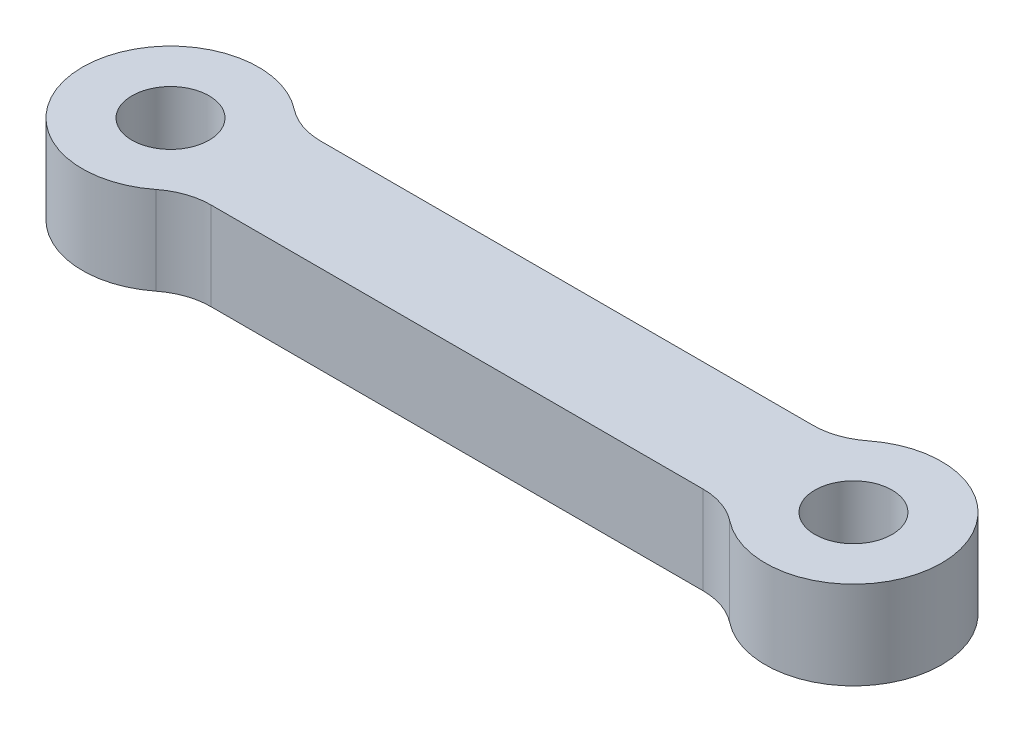
ISO-10303-21;
HEADER;
FILE_DESCRIPTION(('STEP AP214'),'2;1');
FILE_NAME('part.step','',(''),(''),'','','');
FILE_SCHEMA(('AUTOMOTIVE_DESIGN { 1 0 10303 214 1 1 1 1 }'));
ENDSEC;
DATA;
#1=APPLICATION_CONTEXT('core data for automotive mechanical design processes');
#2=APPLICATION_PROTOCOL_DEFINITION('international standard','automotive_design',2000,#1);
#3=PRODUCT_CONTEXT('',#1,'mechanical');
#4=PRODUCT('Part','Part','',(#3));
#5=PRODUCT_RELATED_PRODUCT_CATEGORY('part','',(#4));
#6=PRODUCT_DEFINITION_FORMATION('','',#4);
#7=PRODUCT_DEFINITION_CONTEXT('part definition',#1,'design');
#8=PRODUCT_DEFINITION('design','',#6,#7);
#9=PRODUCT_DEFINITION_SHAPE('','',#8);
#10=(LENGTH_UNIT() NAMED_UNIT(*) SI_UNIT(.MILLI.,.METRE.));
#11=(NAMED_UNIT(*) PLANE_ANGLE_UNIT() SI_UNIT($,.RADIAN.));
#12=(NAMED_UNIT(*) SI_UNIT($,.STERADIAN.) SOLID_ANGLE_UNIT());
#13=UNCERTAINTY_MEASURE_WITH_UNIT(LENGTH_MEASURE(1.E-05),#10,'distance_accuracy_value','');
#14=(GEOMETRIC_REPRESENTATION_CONTEXT(3) GLOBAL_UNCERTAINTY_ASSIGNED_CONTEXT((#13)) GLOBAL_UNIT_ASSIGNED_CONTEXT((#10,
#11,#12)) REPRESENTATION_CONTEXT('',''));
#15=CARTESIAN_POINT('',(0.,0.,0.));
#16=DIRECTION('',(0.,0.,1.));
#17=DIRECTION('',(1.,0.,0.));
#18=AXIS2_PLACEMENT_3D('',#15,#16,#17);
#19=CARTESIAN_POINT('',(-31.,4.,0.));
#20=DIRECTION('',(0.,1.,0.));
#21=DIRECTION('',(0.,0.,1.));
#22=AXIS2_PLACEMENT_3D('',#19,#20,#21);
#23=PLANE('',#22);
#24=CARTESIAN_POINT('',(-31.,4.,0.));
#25=DIRECTION('',(0.,1.,0.));
#26=DIRECTION('',(0.,0.,1.));
#27=AXIS2_PLACEMENT_3D('',#24,#25,#26);
#28=CIRCLE('',#27,1.75);
#29=CARTESIAN_POINT('',(-31.,4.,1.75));
#30=VERTEX_POINT('',#29);
#31=EDGE_CURVE('E178',#30,#30,#28,.T.);
#32=ORIENTED_EDGE('',*,*,#31,.F.);
#33=EDGE_LOOP('',(#32));
#34=FACE_BOUND('',#33,.T.);
#35=DIRECTION('',(-1.,0.,0.));
#36=VECTOR('',#35,1.);
#37=CARTESIAN_POINT('',(-27.8775010008008,4.,-2.5));
#38=LINE('',#37,#36);
#39=CARTESIAN_POINT('',(-4.33012701892219,4.,-2.5));
#40=VERTEX_POINT('',#39);
#41=CARTESIAN_POINT('',(-26.6698729810778,4.,-2.5));
#42=VERTEX_POINT('',#41);
#43=EDGE_CURVE('E125',#40,#42,#38,.T.);
#44=ORIENTED_EDGE('',*,*,#43,.T.);
#45=CARTESIAN_POINT('',(-26.6698729810778,4.,-5.5));
#46=DIRECTION('',(0.,1.,0.));
#47=DIRECTION('',(0.,0.,1.));
#48=AXIS2_PLACEMENT_3D('',#45,#46,#47);
#49=CIRCLE('',#48,3.);
#50=CARTESIAN_POINT('',(-28.525641703473,4.,-3.14285714285714));
#51=VERTEX_POINT('',#50);
#52=EDGE_CURVE('E156',#42,#51,#49,.F.);
#53=ORIENTED_EDGE('',*,*,#52,.T.);
#54=CARTESIAN_POINT('',(-31.,4.,0.));
#55=DIRECTION('',(0.,1.,0.));
#56=DIRECTION('',(0.,0.,1.));
#57=AXIS2_PLACEMENT_3D('',#54,#55,#56);
#58=CIRCLE('',#57,4.);
#59=CARTESIAN_POINT('',(-28.525641703473,4.,3.14285714285714));
#60=VERTEX_POINT('',#59);
#61=EDGE_CURVE('E133',#51,#60,#58,.T.);
#62=ORIENTED_EDGE('',*,*,#61,.T.);
#63=CARTESIAN_POINT('',(-26.6698729810778,4.,5.5));
#64=DIRECTION('',(0.,1.,0.));
#65=DIRECTION('',(0.,0.,1.));
#66=AXIS2_PLACEMENT_3D('',#63,#64,#65);
#67=CIRCLE('',#66,3.);
#68=CARTESIAN_POINT('',(-26.6698729810778,4.,2.5));
#69=VERTEX_POINT('',#68);
#70=EDGE_CURVE('E61',#60,#69,#67,.F.);
#71=ORIENTED_EDGE('',*,*,#70,.T.);
#72=DIRECTION('',(1.,0.,0.));
#73=VECTOR('',#72,1.);
#74=CARTESIAN_POINT('',(-3.1224989991992,4.,2.5));
#75=LINE('',#74,#73);
#76=CARTESIAN_POINT('',(-4.33012701892219,4.,2.5));
#77=VERTEX_POINT('',#76);
#78=EDGE_CURVE('E136',#69,#77,#75,.T.);
#79=ORIENTED_EDGE('',*,*,#78,.T.);
#80=CARTESIAN_POINT('',(-4.33012701892219,4.,5.5));
#81=DIRECTION('',(0.,1.,0.));
#82=DIRECTION('',(0.,0.,1.));
#83=AXIS2_PLACEMENT_3D('',#80,#81,#82);
#84=CIRCLE('',#83,3.);
#85=CARTESIAN_POINT('',(-2.47435829652697,4.,3.14285714285714));
#86=VERTEX_POINT('',#85);
#87=EDGE_CURVE('E11',#77,#86,#84,.F.);
#88=ORIENTED_EDGE('',*,*,#87,.T.);
#89=CARTESIAN_POINT('',(0.,4.,0.));
#90=DIRECTION('',(0.,1.,0.));
#91=DIRECTION('',(0.,0.,1.));
#92=AXIS2_PLACEMENT_3D('',#89,#90,#91);
#93=CIRCLE('',#92,4.);
#94=CARTESIAN_POINT('',(-2.47435829652697,4.,-3.14285714285714));
#95=VERTEX_POINT('',#94);
#96=EDGE_CURVE('E170',#86,#95,#93,.T.);
#97=ORIENTED_EDGE('',*,*,#96,.T.);
#98=CARTESIAN_POINT('',(-4.33012701892219,4.,-5.5));
#99=DIRECTION('',(0.,1.,0.));
#100=DIRECTION('',(0.,0.,1.));
#101=AXIS2_PLACEMENT_3D('',#98,#99,#100);
#102=CIRCLE('',#101,3.);
#103=EDGE_CURVE('E115',#95,#40,#102,.F.);
#104=ORIENTED_EDGE('',*,*,#103,.T.);
#105=EDGE_LOOP('',(#44,#53,#62,#71,#79,#88,#97,#104));
#106=FACE_BOUND('',#105,.T.);
#107=CARTESIAN_POINT('',(0.,4.,0.));
#108=DIRECTION('',(0.,1.,0.));
#109=DIRECTION('',(0.,0.,1.));
#110=AXIS2_PLACEMENT_3D('',#107,#108,#109);
#111=CIRCLE('',#110,1.75);
#112=CARTESIAN_POINT('',(0.,4.,1.75));
#113=VERTEX_POINT('',#112);
#114=EDGE_CURVE('E187',#113,#113,#111,.T.);
#115=ORIENTED_EDGE('',*,*,#114,.F.);
#116=EDGE_LOOP('',(#115));
#117=FACE_BOUND('',#116,.T.);
#118=ADVANCED_FACE('F39',(#34,#106,#117),#23,.T.);
#119=CARTESIAN_POINT('',(-31.,0.,0.));
#120=DIRECTION('',(0.,1.,0.));
#121=DIRECTION('',(0.,0.,1.));
#122=AXIS2_PLACEMENT_3D('',#119,#120,#121);
#123=PLANE('',#122);
#124=CARTESIAN_POINT('',(-31.,0.,0.));
#125=DIRECTION('',(0.,1.,0.));
#126=DIRECTION('',(0.,0.,1.));
#127=AXIS2_PLACEMENT_3D('',#124,#125,#126);
#128=CIRCLE('',#127,4.);
#129=CARTESIAN_POINT('',(-28.525641703473,0.,-3.14285714285714));
#130=VERTEX_POINT('',#129);
#131=CARTESIAN_POINT('',(-28.525641703473,0.,3.14285714285714));
#132=VERTEX_POINT('',#131);
#133=EDGE_CURVE('E165',#130,#132,#128,.T.);
#134=ORIENTED_EDGE('',*,*,#133,.F.);
#135=CARTESIAN_POINT('',(-26.6698729810778,0.,-5.5));
#136=DIRECTION('',(0.,1.,0.));
#137=DIRECTION('',(0.,0.,1.));
#138=AXIS2_PLACEMENT_3D('',#135,#136,#137);
#139=CIRCLE('',#138,3.);
#140=CARTESIAN_POINT('',(-26.6698729810778,0.,-2.5));
#141=VERTEX_POINT('',#140);
#142=EDGE_CURVE('E132',#130,#141,#139,.T.);
#143=ORIENTED_EDGE('',*,*,#142,.T.);
#144=DIRECTION('',(-1.,0.,0.));
#145=VECTOR('',#144,1.);
#146=CARTESIAN_POINT('',(-27.8775010008008,0.,-2.5));
#147=LINE('',#146,#145);
#148=CARTESIAN_POINT('',(-4.33012701892219,0.,-2.5));
#149=VERTEX_POINT('',#148);
#150=EDGE_CURVE('E122',#149,#141,#147,.T.);
#151=ORIENTED_EDGE('',*,*,#150,.F.);
#152=CARTESIAN_POINT('',(-4.33012701892219,0.,-5.5));
#153=DIRECTION('',(0.,1.,0.));
#154=DIRECTION('',(0.,0.,1.));
#155=AXIS2_PLACEMENT_3D('',#152,#153,#154);
#156=CIRCLE('',#155,3.);
#157=CARTESIAN_POINT('',(-2.47435829652697,0.,-3.14285714285714));
#158=VERTEX_POINT('',#157);
#159=EDGE_CURVE('E105',#149,#158,#156,.T.);
#160=ORIENTED_EDGE('',*,*,#159,.T.);
#161=CARTESIAN_POINT('',(0.,0.,0.));
#162=DIRECTION('',(0.,1.,0.));
#163=DIRECTION('',(0.,0.,1.));
#164=AXIS2_PLACEMENT_3D('',#161,#162,#163);
#165=CIRCLE('',#164,4.);
#166=CARTESIAN_POINT('',(-2.47435829652697,0.,3.14285714285714));
#167=VERTEX_POINT('',#166);
#168=EDGE_CURVE('E134',#167,#158,#165,.T.);
#169=ORIENTED_EDGE('',*,*,#168,.F.);
#170=CARTESIAN_POINT('',(-4.33012701892219,0.,5.5));
#171=DIRECTION('',(0.,1.,0.));
#172=DIRECTION('',(0.,0.,1.));
#173=AXIS2_PLACEMENT_3D('',#170,#171,#172);
#174=CIRCLE('',#173,3.);
#175=CARTESIAN_POINT('',(-4.33012701892219,0.,2.5));
#176=VERTEX_POINT('',#175);
#177=EDGE_CURVE('E47',#167,#176,#174,.T.);
#178=ORIENTED_EDGE('',*,*,#177,.T.);
#179=DIRECTION('',(1.,0.,0.));
#180=VECTOR('',#179,1.);
#181=CARTESIAN_POINT('',(-3.1224989991992,0.,2.5));
#182=LINE('',#181,#180);
#183=CARTESIAN_POINT('',(-26.6698729810778,0.,2.5));
#184=VERTEX_POINT('',#183);
#185=EDGE_CURVE('E138',#184,#176,#182,.T.);
#186=ORIENTED_EDGE('',*,*,#185,.F.);
#187=CARTESIAN_POINT('',(-26.6698729810778,0.,5.5));
#188=DIRECTION('',(0.,1.,0.));
#189=DIRECTION('',(0.,0.,1.));
#190=AXIS2_PLACEMENT_3D('',#187,#188,#189);
#191=CIRCLE('',#190,3.);
#192=EDGE_CURVE('E158',#184,#132,#191,.T.);
#193=ORIENTED_EDGE('',*,*,#192,.T.);
#194=EDGE_LOOP('',(#134,#143,#151,#160,#169,#178,#186,#193));
#195=FACE_BOUND('',#194,.T.);
#196=CARTESIAN_POINT('',(-31.,0.,0.));
#197=DIRECTION('',(0.,1.,0.));
#198=DIRECTION('',(0.,0.,1.));
#199=AXIS2_PLACEMENT_3D('',#196,#197,#198);
#200=CIRCLE('',#199,1.75);
#201=CARTESIAN_POINT('',(-31.,0.,1.75));
#202=VERTEX_POINT('',#201);
#203=EDGE_CURVE('E182',#202,#202,#200,.T.);
#204=ORIENTED_EDGE('',*,*,#203,.T.);
#205=EDGE_LOOP('',(#204));
#206=FACE_BOUND('',#205,.T.);
#207=CARTESIAN_POINT('',(0.,0.,0.));
#208=DIRECTION('',(0.,1.,0.));
#209=DIRECTION('',(0.,0.,1.));
#210=AXIS2_PLACEMENT_3D('',#207,#208,#209);
#211=CIRCLE('',#210,1.75);
#212=CARTESIAN_POINT('',(0.,0.,1.75));
#213=VERTEX_POINT('',#212);
#214=EDGE_CURVE('E190',#213,#213,#211,.T.);
#215=ORIENTED_EDGE('',*,*,#214,.T.);
#216=EDGE_LOOP('',(#215));
#217=FACE_BOUND('',#216,.T.);
#218=ADVANCED_FACE('F130',(#195,#206,#217),#123,.F.);
#219=CARTESIAN_POINT('',(-31.,4.,0.));
#220=DIRECTION('',(0.,-1.,0.));
#221=DIRECTION('',(0.,0.,-1.));
#222=AXIS2_PLACEMENT_3D('',#219,#220,#221);
#223=CYLINDRICAL_SURFACE('',#222,4.);
#224=ORIENTED_EDGE('',*,*,#61,.F.);
#225=DIRECTION('',(0.,-1.,0.));
#226=VECTOR('',#225,1.);
#227=CARTESIAN_POINT('',(-28.525641703473,4.,-3.14285714285714));
#228=LINE('',#227,#226);
#229=EDGE_CURVE('E148',#51,#130,#228,.T.);
#230=ORIENTED_EDGE('',*,*,#229,.T.);
#231=ORIENTED_EDGE('',*,*,#133,.T.);
#232=DIRECTION('',(0.,-1.,0.));
#233=VECTOR('',#232,1.);
#234=CARTESIAN_POINT('',(-28.525641703473,4.,3.14285714285714));
#235=LINE('',#234,#233);
#236=EDGE_CURVE('E146',#132,#60,#235,.F.);
#237=ORIENTED_EDGE('',*,*,#236,.T.);
#238=EDGE_LOOP('',(#224,#230,#231,#237));
#239=FACE_BOUND('',#238,.T.);
#240=ADVANCED_FACE('F205',(#239),#223,.T.);
#241=CARTESIAN_POINT('',(-3.1224989991992,4.,2.5));
#242=DIRECTION('',(0.,0.,-1.));
#243=DIRECTION('',(-1.,0.,0.));
#244=AXIS2_PLACEMENT_3D('',#241,#242,#243);
#245=PLANE('',#244);
#246=ORIENTED_EDGE('',*,*,#78,.F.);
#247=DIRECTION('',(0.,1.,0.));
#248=VECTOR('',#247,1.);
#249=CARTESIAN_POINT('',(-26.6698729810778,0.,2.5));
#250=LINE('',#249,#248);
#251=EDGE_CURVE('E116',#69,#184,#250,.F.);
#252=ORIENTED_EDGE('',*,*,#251,.T.);
#253=ORIENTED_EDGE('',*,*,#185,.T.);
#254=DIRECTION('',(0.,1.,0.));
#255=VECTOR('',#254,1.);
#256=CARTESIAN_POINT('',(-4.33012701892219,4.,2.5));
#257=LINE('',#256,#255);
#258=EDGE_CURVE('E54',#176,#77,#257,.T.);
#259=ORIENTED_EDGE('',*,*,#258,.T.);
#260=EDGE_LOOP('',(#246,#252,#253,#259));
#261=FACE_BOUND('',#260,.T.);
#262=ADVANCED_FACE('F163',(#261),#245,.F.);
#263=CARTESIAN_POINT('',(0.,4.,0.));
#264=DIRECTION('',(0.,-1.,0.));
#265=DIRECTION('',(0.,0.,-1.));
#266=AXIS2_PLACEMENT_3D('',#263,#264,#265);
#267=CYLINDRICAL_SURFACE('',#266,4.);
#268=ORIENTED_EDGE('',*,*,#168,.T.);
#269=DIRECTION('',(0.,-1.,0.));
#270=VECTOR('',#269,1.);
#271=CARTESIAN_POINT('',(-2.47435829652697,4.,-3.14285714285714));
#272=LINE('',#271,#270);
#273=EDGE_CURVE('E110',#158,#95,#272,.F.);
#274=ORIENTED_EDGE('',*,*,#273,.T.);
#275=ORIENTED_EDGE('',*,*,#96,.F.);
#276=DIRECTION('',(0.,-1.,0.));
#277=VECTOR('',#276,1.);
#278=CARTESIAN_POINT('',(-2.47435829652697,4.,3.14285714285714));
#279=LINE('',#278,#277);
#280=EDGE_CURVE('E126',#86,#167,#279,.T.);
#281=ORIENTED_EDGE('',*,*,#280,.T.);
#282=EDGE_LOOP('',(#268,#274,#275,#281));
#283=FACE_BOUND('',#282,.T.);
#284=ADVANCED_FACE('F172',(#283),#267,.T.);
#285=CARTESIAN_POINT('',(-27.8775010008008,4.,-2.5));
#286=DIRECTION('',(0.,0.,1.));
#287=DIRECTION('',(1.,0.,0.));
#288=AXIS2_PLACEMENT_3D('',#285,#286,#287);
#289=PLANE('',#288);
#290=ORIENTED_EDGE('',*,*,#43,.F.);
#291=DIRECTION('',(0.,1.,0.));
#292=VECTOR('',#291,1.);
#293=CARTESIAN_POINT('',(-4.33012701892219,0.,-2.5));
#294=LINE('',#293,#292);
#295=EDGE_CURVE('E109',#40,#149,#294,.F.);
#296=ORIENTED_EDGE('',*,*,#295,.T.);
#297=ORIENTED_EDGE('',*,*,#150,.T.);
#298=DIRECTION('',(0.,1.,0.));
#299=VECTOR('',#298,1.);
#300=CARTESIAN_POINT('',(-26.6698729810778,4.,-2.5));
#301=LINE('',#300,#299);
#302=EDGE_CURVE('E127',#141,#42,#301,.T.);
#303=ORIENTED_EDGE('',*,*,#302,.T.);
#304=EDGE_LOOP('',(#290,#296,#297,#303));
#305=FACE_BOUND('',#304,.T.);
#306=ADVANCED_FACE('F121',(#305),#289,.F.);
#307=CARTESIAN_POINT('',(-31.,4.,0.));
#308=DIRECTION('',(0.,-1.,0.));
#309=DIRECTION('',(0.,0.,-1.));
#310=AXIS2_PLACEMENT_3D('',#307,#308,#309);
#311=CYLINDRICAL_SURFACE('',#310,1.75);
#312=ORIENTED_EDGE('',*,*,#31,.T.);
#313=EDGE_LOOP('',(#312));
#314=FACE_BOUND('',#313,.T.);
#315=ORIENTED_EDGE('',*,*,#203,.F.);
#316=EDGE_LOOP('',(#315));
#317=FACE_BOUND('',#316,.T.);
#318=ADVANCED_FACE('F208',(#314,#317),#311,.F.);
#319=CARTESIAN_POINT('',(0.,4.,0.));
#320=DIRECTION('',(0.,-1.,0.));
#321=DIRECTION('',(0.,0.,-1.));
#322=AXIS2_PLACEMENT_3D('',#319,#320,#321);
#323=CYLINDRICAL_SURFACE('',#322,1.75);
#324=ORIENTED_EDGE('',*,*,#114,.T.);
#325=EDGE_LOOP('',(#324));
#326=FACE_BOUND('',#325,.T.);
#327=ORIENTED_EDGE('',*,*,#214,.F.);
#328=EDGE_LOOP('',(#327));
#329=FACE_BOUND('',#328,.T.);
#330=ADVANCED_FACE('F196',(#326,#329),#323,.F.);
#331=CARTESIAN_POINT('',(-4.33012701892219,4.,-5.5));
#332=DIRECTION('',(0.,-1.,0.));
#333=DIRECTION('',(0.,0.,-1.));
#334=AXIS2_PLACEMENT_3D('',#331,#332,#333);
#335=CYLINDRICAL_SURFACE('',#334,3.);
#336=ORIENTED_EDGE('',*,*,#103,.F.);
#337=ORIENTED_EDGE('',*,*,#273,.F.);
#338=ORIENTED_EDGE('',*,*,#159,.F.);
#339=ORIENTED_EDGE('',*,*,#295,.F.);
#340=EDGE_LOOP('',(#336,#337,#338,#339));
#341=FACE_BOUND('',#340,.T.);
#342=ADVANCED_FACE('F108',(#341),#335,.F.);
#343=CARTESIAN_POINT('',(-26.6698729810778,4.,-5.5));
#344=DIRECTION('',(0.,-1.,0.));
#345=DIRECTION('',(0.,0.,-1.));
#346=AXIS2_PLACEMENT_3D('',#343,#344,#345);
#347=CYLINDRICAL_SURFACE('',#346,3.);
#348=ORIENTED_EDGE('',*,*,#52,.F.);
#349=ORIENTED_EDGE('',*,*,#302,.F.);
#350=ORIENTED_EDGE('',*,*,#142,.F.);
#351=ORIENTED_EDGE('',*,*,#229,.F.);
#352=EDGE_LOOP('',(#348,#349,#350,#351));
#353=FACE_BOUND('',#352,.T.);
#354=ADVANCED_FACE('F221',(#353),#347,.F.);
#355=CARTESIAN_POINT('',(-26.6698729810778,4.,5.5));
#356=DIRECTION('',(0.,-1.,0.));
#357=DIRECTION('',(0.,0.,-1.));
#358=AXIS2_PLACEMENT_3D('',#355,#356,#357);
#359=CYLINDRICAL_SURFACE('',#358,3.);
#360=ORIENTED_EDGE('',*,*,#70,.F.);
#361=ORIENTED_EDGE('',*,*,#236,.F.);
#362=ORIENTED_EDGE('',*,*,#192,.F.);
#363=ORIENTED_EDGE('',*,*,#251,.F.);
#364=EDGE_LOOP('',(#360,#361,#362,#363));
#365=FACE_BOUND('',#364,.T.);
#366=ADVANCED_FACE('F223',(#365),#359,.F.);
#367=CARTESIAN_POINT('',(-4.33012701892219,4.,5.5));
#368=DIRECTION('',(0.,-1.,0.));
#369=DIRECTION('',(0.,0.,-1.));
#370=AXIS2_PLACEMENT_3D('',#367,#368,#369);
#371=CYLINDRICAL_SURFACE('',#370,3.);
#372=ORIENTED_EDGE('',*,*,#87,.F.);
#373=ORIENTED_EDGE('',*,*,#258,.F.);
#374=ORIENTED_EDGE('',*,*,#177,.F.);
#375=ORIENTED_EDGE('',*,*,#280,.F.);
#376=EDGE_LOOP('',(#372,#373,#374,#375));
#377=FACE_BOUND('',#376,.T.);
#378=ADVANCED_FACE('F41',(#377),#371,.F.);
#379=CLOSED_SHELL('',(#118,#218,#240,#262,#284,#306,#318,#330,#342,#354,#366,#378));
#380=MANIFOLD_SOLID_BREP('B2',#379);
#381=ADVANCED_BREP_SHAPE_REPRESENTATION('',(#18,#380),#14);
#382=SHAPE_DEFINITION_REPRESENTATION(#9,#381);
ENDSEC;
END-ISO-10303-21;
